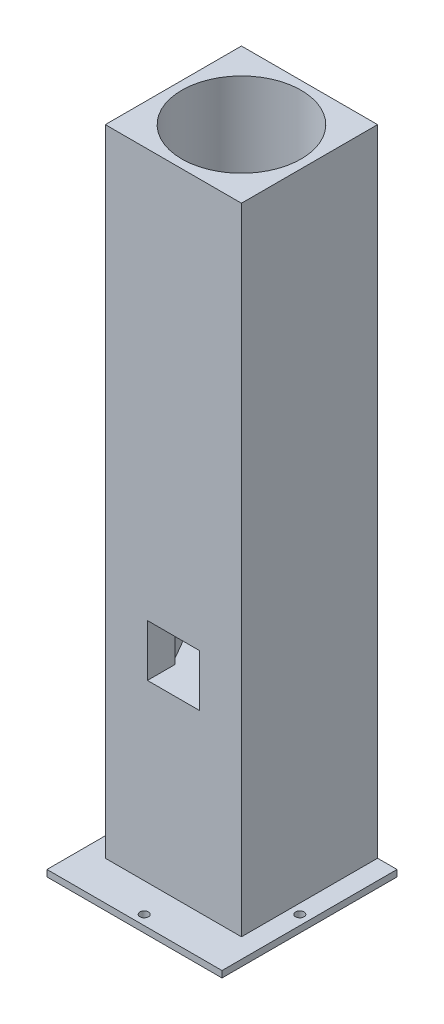
ISO-10303-21;
HEADER;
FILE_DESCRIPTION(('STEP AP214'),'2;1');
FILE_NAME('part.step','',(''),(''),'','','');
FILE_SCHEMA(('AUTOMOTIVE_DESIGN { 1 0 10303 214 1 1 1 1 }'));
ENDSEC;
DATA;
#1=APPLICATION_CONTEXT('core data for automotive mechanical design processes');
#2=APPLICATION_PROTOCOL_DEFINITION('international standard','automotive_design',2000,#1);
#3=PRODUCT_CONTEXT('',#1,'mechanical');
#4=PRODUCT('Part','Part','',(#3));
#5=PRODUCT_RELATED_PRODUCT_CATEGORY('part','',(#4));
#6=PRODUCT_DEFINITION_FORMATION('','',#4);
#7=PRODUCT_DEFINITION_CONTEXT('part definition',#1,'design');
#8=PRODUCT_DEFINITION('design','',#6,#7);
#9=PRODUCT_DEFINITION_SHAPE('','',#8);
#10=(LENGTH_UNIT() NAMED_UNIT(*) SI_UNIT(.MILLI.,.METRE.));
#11=(NAMED_UNIT(*) PLANE_ANGLE_UNIT() SI_UNIT($,.RADIAN.));
#12=(NAMED_UNIT(*) SI_UNIT($,.STERADIAN.) SOLID_ANGLE_UNIT());
#13=UNCERTAINTY_MEASURE_WITH_UNIT(LENGTH_MEASURE(1.E-05),#10,'distance_accuracy_value','');
#14=(GEOMETRIC_REPRESENTATION_CONTEXT(3) GLOBAL_UNCERTAINTY_ASSIGNED_CONTEXT((#13)) GLOBAL_UNIT_ASSIGNED_CONTEXT((#10,
#11,#12)) REPRESENTATION_CONTEXT('',''));
#15=CARTESIAN_POINT('',(0.,0.,0.));
#16=DIRECTION('',(0.,0.,1.));
#17=DIRECTION('',(1.,0.,0.));
#18=AXIS2_PLACEMENT_3D('',#15,#16,#17);
#19=CARTESIAN_POINT('',(0.,50.,26.25));
#20=DIRECTION('',(0.,0.,-1.));
#21=DIRECTION('',(-1.,0.,0.));
#22=AXIS2_PLACEMENT_3D('',#19,#20,#21);
#23=PLANE('',#22);
#24=DIRECTION('',(-1.,0.,0.));
#25=VECTOR('',#24,1.);
#26=CARTESIAN_POINT('',(10.,20.,26.25));
#27=LINE('',#26,#25);
#28=CARTESIAN_POINT('',(10.,20.,26.25));
#29=VERTEX_POINT('',#28);
#30=CARTESIAN_POINT('',(-10.,20.,26.25));
#31=VERTEX_POINT('',#30);
#32=EDGE_CURVE('E386',#29,#31,#27,.T.);
#33=ORIENTED_EDGE('',*,*,#32,.F.);
#34=DIRECTION('',(0.,1.,0.));
#35=VECTOR('',#34,1.);
#36=CARTESIAN_POINT('',(10.,20.,26.25));
#37=LINE('',#36,#35);
#38=CARTESIAN_POINT('',(10.,0.,26.25));
#39=VERTEX_POINT('',#38);
#40=EDGE_CURVE('E373',#39,#29,#37,.T.);
#41=ORIENTED_EDGE('',*,*,#40,.F.);
#42=DIRECTION('',(1.,0.,0.));
#43=VECTOR('',#42,1.);
#44=CARTESIAN_POINT('',(10.,0.,26.25));
#45=LINE('',#44,#43);
#46=CARTESIAN_POINT('',(-10.,0.,26.25));
#47=VERTEX_POINT('',#46);
#48=EDGE_CURVE('E393',#47,#39,#45,.T.);
#49=ORIENTED_EDGE('',*,*,#48,.F.);
#50=DIRECTION('',(0.,-1.,0.));
#51=VECTOR('',#50,1.);
#52=CARTESIAN_POINT('',(-10.,20.,26.25));
#53=LINE('',#52,#51);
#54=EDGE_CURVE('E389',#31,#47,#53,.T.);
#55=ORIENTED_EDGE('',*,*,#54,.F.);
#56=EDGE_LOOP('',(#33,#41,#49,#55));
#57=FACE_BOUND('',#56,.T.);
#58=DIRECTION('',(-1.,0.,0.));
#59=VECTOR('',#58,1.);
#60=CARTESIAN_POINT('',(0.,-67.5,26.25));
#61=LINE('',#60,#59);
#62=CARTESIAN_POINT('',(26.25,-67.5,26.25));
#63=VERTEX_POINT('',#62);
#64=CARTESIAN_POINT('',(-26.25,-67.5,26.25));
#65=VERTEX_POINT('',#64);
#66=EDGE_CURVE('E329',#63,#65,#61,.T.);
#67=ORIENTED_EDGE('',*,*,#66,.F.);
#68=DIRECTION('',(0.,-1.,0.));
#69=VECTOR('',#68,1.);
#70=CARTESIAN_POINT('',(26.25,198.41623264269,26.25));
#71=LINE('',#70,#69);
#72=CARTESIAN_POINT('',(26.25,177.5,26.25));
#73=VERTEX_POINT('',#72);
#74=EDGE_CURVE('E434',#73,#63,#71,.T.);
#75=ORIENTED_EDGE('',*,*,#74,.F.);
#76=DIRECTION('',(-1.,0.,0.));
#77=VECTOR('',#76,1.);
#78=CARTESIAN_POINT('',(0.,177.5,26.25));
#79=LINE('',#78,#77);
#80=CARTESIAN_POINT('',(-26.25,177.5,26.25));
#81=VERTEX_POINT('',#80);
#82=EDGE_CURVE('E448',#73,#81,#79,.T.);
#83=ORIENTED_EDGE('',*,*,#82,.T.);
#84=DIRECTION('',(0.,-1.,0.));
#85=VECTOR('',#84,1.);
#86=CARTESIAN_POINT('',(-26.25,198.41623264269,26.25));
#87=LINE('',#86,#85);
#88=EDGE_CURVE('E428',#81,#65,#87,.T.);
#89=ORIENTED_EDGE('',*,*,#88,.T.);
#90=EDGE_LOOP('',(#67,#75,#83,#89));
#91=FACE_BOUND('',#90,.T.);
#92=ADVANCED_FACE('F74',(#57,#91),#23,.F.);
#93=CARTESIAN_POINT('',(26.25,50.,0.));
#94=DIRECTION('',(-1.,0.,0.));
#95=DIRECTION('',(0.,0.,1.));
#96=AXIS2_PLACEMENT_3D('',#93,#94,#95);
#97=PLANE('',#96);
#98=DIRECTION('',(0.,0.,1.));
#99=VECTOR('',#98,1.);
#100=CARTESIAN_POINT('',(26.25,-67.5,0.));
#101=LINE('',#100,#99);
#102=CARTESIAN_POINT('',(26.25,-67.5,-26.25));
#103=VERTEX_POINT('',#102);
#104=EDGE_CURVE('E332',#103,#63,#101,.T.);
#105=ORIENTED_EDGE('',*,*,#104,.F.);
#106=DIRECTION('',(0.,-1.,0.));
#107=VECTOR('',#106,1.);
#108=CARTESIAN_POINT('',(26.25,198.41623264269,-26.25));
#109=LINE('',#108,#107);
#110=CARTESIAN_POINT('',(26.25,177.5,-26.25));
#111=VERTEX_POINT('',#110);
#112=EDGE_CURVE('E429',#111,#103,#109,.T.);
#113=ORIENTED_EDGE('',*,*,#112,.F.);
#114=DIRECTION('',(0.,0.,1.));
#115=VECTOR('',#114,1.);
#116=CARTESIAN_POINT('',(26.25,177.5,0.));
#117=LINE('',#116,#115);
#118=EDGE_CURVE('E452',#111,#73,#117,.T.);
#119=ORIENTED_EDGE('',*,*,#118,.T.);
#120=ORIENTED_EDGE('',*,*,#74,.T.);
#121=EDGE_LOOP('',(#105,#113,#119,#120));
#122=FACE_BOUND('',#121,.T.);
#123=ADVANCED_FACE('F667',(#122),#97,.F.);
#124=CARTESIAN_POINT('',(-26.25,50.,0.));
#125=DIRECTION('',(-1.,0.,0.));
#126=DIRECTION('',(0.,0.,1.));
#127=AXIS2_PLACEMENT_3D('',#124,#125,#126);
#128=PLANE('',#127);
#129=DIRECTION('',(0.,-1.,0.));
#130=VECTOR('',#129,1.);
#131=CARTESIAN_POINT('',(-26.25,198.41623264269,-26.25));
#132=LINE('',#131,#130);
#133=CARTESIAN_POINT('',(-26.25,177.5,-26.25));
#134=VERTEX_POINT('',#133);
#135=CARTESIAN_POINT('',(-26.25,-67.5,-26.25));
#136=VERTEX_POINT('',#135);
#137=EDGE_CURVE('E433',#134,#136,#132,.T.);
#138=ORIENTED_EDGE('',*,*,#137,.T.);
#139=DIRECTION('',(0.,0.,-1.));
#140=VECTOR('',#139,1.);
#141=CARTESIAN_POINT('',(-26.25,-67.5,0.));
#142=LINE('',#141,#140);
#143=EDGE_CURVE('E326',#65,#136,#142,.T.);
#144=ORIENTED_EDGE('',*,*,#143,.F.);
#145=ORIENTED_EDGE('',*,*,#88,.F.);
#146=DIRECTION('',(0.,0.,1.));
#147=VECTOR('',#146,1.);
#148=CARTESIAN_POINT('',(-26.25,177.5,0.));
#149=LINE('',#148,#147);
#150=EDGE_CURVE('E459',#134,#81,#149,.T.);
#151=ORIENTED_EDGE('',*,*,#150,.F.);
#152=EDGE_LOOP('',(#138,#144,#145,#151));
#153=FACE_BOUND('',#152,.T.);
#154=ADVANCED_FACE('F672',(#153),#128,.T.);
#155=CARTESIAN_POINT('',(0.,50.,0.));
#156=DIRECTION('',(0.,1.,0.));
#157=DIRECTION('',(0.,0.,1.));
#158=AXIS2_PLACEMENT_3D('',#155,#156,#157);
#159=PLANE('',#158);
#160=DIRECTION('',(0.,0.,1.));
#161=VECTOR('',#160,1.);
#162=CARTESIAN_POINT('',(-18.4781654946951,50.,0.));
#163=LINE('',#162,#161);
#164=CARTESIAN_POINT('',(-18.4781654946951,50.,-2.46999999999999));
#165=VERTEX_POINT('',#164);
#166=CARTESIAN_POINT('',(-18.4781654946951,50.,2.47000000000001));
#167=VERTEX_POINT('',#166);
#168=EDGE_CURVE('E463',#165,#167,#163,.T.);
#169=ORIENTED_EDGE('',*,*,#168,.F.);
#170=DIRECTION('',(0.5,0.,-0.866025403784439));
#171=VECTOR('',#170,1.);
#172=CARTESIAN_POINT('',(-14.9281654946951,50.,-8.61878036686951));
#173=LINE('',#172,#171);
#174=CARTESIAN_POINT('',(-11.3781654946951,50.,-14.767560733739));
#175=VERTEX_POINT('',#174);
#176=EDGE_CURVE('E467',#165,#175,#173,.T.);
#177=ORIENTED_EDGE('',*,*,#176,.T.);
#178=DIRECTION('',(-0.866025403784439,0.,0.5));
#179=VECTOR('',#178,1.);
#180=CARTESIAN_POINT('',(-9.23908274734755,50.,-16.002560733739));
#181=LINE('',#180,#179);
#182=CARTESIAN_POINT('',(-7.1,50.,-17.237560733739));
#183=VERTEX_POINT('',#182);
#184=EDGE_CURVE('E471',#183,#175,#181,.T.);
#185=ORIENTED_EDGE('',*,*,#184,.F.);
#186=DIRECTION('',(1.,0.,0.));
#187=VECTOR('',#186,1.);
#188=CARTESIAN_POINT('',(0.,50.,-17.237560733739));
#189=LINE('',#188,#187);
#190=CARTESIAN_POINT('',(7.1,50.,-17.237560733739));
#191=VERTEX_POINT('',#190);
#192=EDGE_CURVE('E475',#183,#191,#189,.T.);
#193=ORIENTED_EDGE('',*,*,#192,.T.);
#194=DIRECTION('',(-0.866025403784439,0.,-0.5));
#195=VECTOR('',#194,1.);
#196=CARTESIAN_POINT('',(9.23908274734756,50.,-16.002560733739));
#197=LINE('',#196,#195);
#198=CARTESIAN_POINT('',(11.3781654946951,50.,-14.767560733739));
#199=VERTEX_POINT('',#198);
#200=EDGE_CURVE('E478',#199,#191,#197,.T.);
#201=ORIENTED_EDGE('',*,*,#200,.F.);
#202=DIRECTION('',(0.5,0.,0.866025403784438));
#203=VECTOR('',#202,1.);
#204=CARTESIAN_POINT('',(14.9281654946951,50.,-8.61878036686952));
#205=LINE('',#204,#203);
#206=CARTESIAN_POINT('',(18.4781654946951,50.,-2.47));
#207=VERTEX_POINT('',#206);
#208=EDGE_CURVE('E482',#199,#207,#205,.T.);
#209=ORIENTED_EDGE('',*,*,#208,.T.);
#210=DIRECTION('',(0.,0.,-1.));
#211=VECTOR('',#210,1.);
#212=CARTESIAN_POINT('',(18.4781654946951,50.,0.));
#213=LINE('',#212,#211);
#214=CARTESIAN_POINT('',(18.4781654946951,50.,2.47));
#215=VERTEX_POINT('',#214);
#216=EDGE_CURVE('E485',#215,#207,#213,.T.);
#217=ORIENTED_EDGE('',*,*,#216,.F.);
#218=DIRECTION('',(-0.5,0.,0.866025403784439));
#219=VECTOR('',#218,1.);
#220=CARTESIAN_POINT('',(14.9281654946951,50.,8.61878036686951));
#221=LINE('',#220,#219);
#222=CARTESIAN_POINT('',(11.3781654946951,50.,14.767560733739));
#223=VERTEX_POINT('',#222);
#224=EDGE_CURVE('E489',#215,#223,#221,.T.);
#225=ORIENTED_EDGE('',*,*,#224,.T.);
#226=DIRECTION('',(0.866025403784439,0.,-0.5));
#227=VECTOR('',#226,1.);
#228=CARTESIAN_POINT('',(9.23908274734756,50.,16.002560733739));
#229=LINE('',#228,#227);
#230=CARTESIAN_POINT('',(7.1,50.,17.237560733739));
#231=VERTEX_POINT('',#230);
#232=EDGE_CURVE('E492',#231,#223,#229,.T.);
#233=ORIENTED_EDGE('',*,*,#232,.F.);
#234=DIRECTION('',(-1.,0.,0.));
#235=VECTOR('',#234,1.);
#236=CARTESIAN_POINT('',(0.,50.,17.237560733739));
#237=LINE('',#236,#235);
#238=CARTESIAN_POINT('',(-7.1,50.,17.237560733739));
#239=VERTEX_POINT('',#238);
#240=EDGE_CURVE('E496',#231,#239,#237,.T.);
#241=ORIENTED_EDGE('',*,*,#240,.T.);
#242=DIRECTION('',(0.866025403784439,0.,0.499999999999999));
#243=VECTOR('',#242,1.);
#244=CARTESIAN_POINT('',(-9.23908274734755,50.,16.002560733739));
#245=LINE('',#244,#243);
#246=CARTESIAN_POINT('',(-11.3781654946951,50.,14.767560733739));
#247=VERTEX_POINT('',#246);
#248=EDGE_CURVE('E499',#247,#239,#245,.T.);
#249=ORIENTED_EDGE('',*,*,#248,.F.);
#250=DIRECTION('',(-0.5,0.,-0.866025403784439));
#251=VECTOR('',#250,1.);
#252=CARTESIAN_POINT('',(-14.9281654946951,50.,8.61878036686952));
#253=LINE('',#252,#251);
#254=EDGE_CURVE('E503',#247,#167,#253,.T.);
#255=ORIENTED_EDGE('',*,*,#254,.T.);
#256=EDGE_LOOP('',(#169,#177,#185,#193,#201,#209,#217,#225,#233,#241,#249,#255));
#257=FACE_BOUND('',#256,.T.);
#258=CARTESIAN_POINT('',(0.,50.,0.));
#259=DIRECTION('',(0.,1.,0.));
#260=DIRECTION('',(0.,0.,1.));
#261=AXIS2_PLACEMENT_3D('',#258,#259,#260);
#262=CIRCLE('',#261,23.);
#263=CARTESIAN_POINT('',(0.,50.,23.));
#264=VERTEX_POINT('',#263);
#265=EDGE_CURVE('E12',#264,#264,#262,.F.);
#266=ORIENTED_EDGE('',*,*,#265,.F.);
#267=EDGE_LOOP('',(#266));
#268=FACE_BOUND('',#267,.T.);
#269=ADVANCED_FACE('F606',(#257,#268),#159,.T.);
#270=CARTESIAN_POINT('',(-18.4781654946951,50.,0.));
#271=DIRECTION('',(1.,0.,0.));
#272=DIRECTION('',(0.,0.,-1.));
#273=AXIS2_PLACEMENT_3D('',#270,#271,#272);
#274=PLANE('',#273);
#275=DIRECTION('',(0.,0.,1.));
#276=VECTOR('',#275,1.);
#277=CARTESIAN_POINT('',(-18.4781654946951,0.,0.));
#278=LINE('',#277,#276);
#279=CARTESIAN_POINT('',(-18.4781654946951,0.,-2.46999999999999));
#280=VERTEX_POINT('',#279);
#281=CARTESIAN_POINT('',(-18.4781654946951,0.,2.47000000000001));
#282=VERTEX_POINT('',#281);
#283=EDGE_CURVE('E462',#280,#282,#278,.T.);
#284=ORIENTED_EDGE('',*,*,#283,.F.);
#285=DIRECTION('',(0.,-1.,0.));
#286=VECTOR('',#285,1.);
#287=CARTESIAN_POINT('',(-18.4781654946951,50.,-2.46999999999999));
#288=LINE('',#287,#286);
#289=EDGE_CURVE('E82',#165,#280,#288,.T.);
#290=ORIENTED_EDGE('',*,*,#289,.F.);
#291=ORIENTED_EDGE('',*,*,#168,.T.);
#292=DIRECTION('',(0.,-1.,0.));
#293=VECTOR('',#292,1.);
#294=CARTESIAN_POINT('',(-18.4781654946951,50.,2.47000000000001));
#295=LINE('',#294,#293);
#296=EDGE_CURVE('E506',#167,#282,#295,.T.);
#297=ORIENTED_EDGE('',*,*,#296,.T.);
#298=EDGE_LOOP('',(#284,#290,#291,#297));
#299=FACE_BOUND('',#298,.T.);
#300=ADVANCED_FACE('F595',(#299),#274,.T.);
#301=CARTESIAN_POINT('',(-14.9281654946951,50.,-8.61878036686951));
#302=DIRECTION('',(-0.866025403784439,0.,-0.499999999999999));
#303=DIRECTION('',(-0.5,0.,0.866025403784439));
#304=AXIS2_PLACEMENT_3D('',#301,#302,#303);
#305=PLANE('',#304);
#306=DIRECTION('',(0.5,0.,-0.866025403784439));
#307=VECTOR('',#306,1.);
#308=CARTESIAN_POINT('',(-14.9281654946951,0.,-8.61878036686951));
#309=LINE('',#308,#307);
#310=CARTESIAN_POINT('',(-11.3781654946951,0.,-14.767560733739));
#311=VERTEX_POINT('',#310);
#312=EDGE_CURVE('E509',#280,#311,#309,.T.);
#313=ORIENTED_EDGE('',*,*,#312,.T.);
#314=DIRECTION('',(0.,-1.,0.));
#315=VECTOR('',#314,1.);
#316=CARTESIAN_POINT('',(-11.3781654946951,50.,-14.767560733739));
#317=LINE('',#316,#315);
#318=EDGE_CURVE('E583',#175,#311,#317,.T.);
#319=ORIENTED_EDGE('',*,*,#318,.F.);
#320=ORIENTED_EDGE('',*,*,#176,.F.);
#321=ORIENTED_EDGE('',*,*,#289,.T.);
#322=EDGE_LOOP('',(#313,#319,#320,#321));
#323=FACE_BOUND('',#322,.T.);
#324=ADVANCED_FACE('F591',(#323),#305,.F.);
#325=CARTESIAN_POINT('',(-9.23908274734755,50.,-16.002560733739));
#326=DIRECTION('',(0.499999999999999,0.,0.866025403784439));
#327=DIRECTION('',(0.866025403784439,0.,-0.5));
#328=AXIS2_PLACEMENT_3D('',#325,#326,#327);
#329=PLANE('',#328);
#330=DIRECTION('',(-0.866025403784439,0.,0.5));
#331=VECTOR('',#330,1.);
#332=CARTESIAN_POINT('',(-9.23908274734755,0.,-16.002560733739));
#333=LINE('',#332,#331);
#334=CARTESIAN_POINT('',(-7.1,0.,-17.237560733739));
#335=VERTEX_POINT('',#334);
#336=EDGE_CURVE('E513',#335,#311,#333,.T.);
#337=ORIENTED_EDGE('',*,*,#336,.F.);
#338=DIRECTION('',(0.,-1.,0.));
#339=VECTOR('',#338,1.);
#340=CARTESIAN_POINT('',(-7.1,50.,-17.237560733739));
#341=LINE('',#340,#339);
#342=EDGE_CURVE('E579',#183,#335,#341,.T.);
#343=ORIENTED_EDGE('',*,*,#342,.F.);
#344=ORIENTED_EDGE('',*,*,#184,.T.);
#345=ORIENTED_EDGE('',*,*,#318,.T.);
#346=EDGE_LOOP('',(#337,#343,#344,#345));
#347=FACE_BOUND('',#346,.T.);
#348=ADVANCED_FACE('F602',(#347),#329,.T.);
#349=CARTESIAN_POINT('',(0.,50.,-17.237560733739));
#350=DIRECTION('',(0.,0.,-1.));
#351=DIRECTION('',(-1.,0.,0.));
#352=AXIS2_PLACEMENT_3D('',#349,#350,#351);
#353=PLANE('',#352);
#354=DIRECTION('',(1.,0.,0.));
#355=VECTOR('',#354,1.);
#356=CARTESIAN_POINT('',(0.,0.,-17.237560733739));
#357=LINE('',#356,#355);
#358=CARTESIAN_POINT('',(7.1,0.,-17.237560733739));
#359=VERTEX_POINT('',#358);
#360=EDGE_CURVE('E516',#335,#359,#357,.T.);
#361=ORIENTED_EDGE('',*,*,#360,.T.);
#362=DIRECTION('',(0.,-1.,0.));
#363=VECTOR('',#362,1.);
#364=CARTESIAN_POINT('',(7.1,50.,-17.237560733739));
#365=LINE('',#364,#363);
#366=EDGE_CURVE('E575',#191,#359,#365,.T.);
#367=ORIENTED_EDGE('',*,*,#366,.F.);
#368=ORIENTED_EDGE('',*,*,#192,.F.);
#369=ORIENTED_EDGE('',*,*,#342,.T.);
#370=EDGE_LOOP('',(#361,#367,#368,#369));
#371=FACE_BOUND('',#370,.T.);
#372=ADVANCED_FACE('F657',(#371),#353,.F.);
#373=CARTESIAN_POINT('',(9.23908274734756,50.,-16.002560733739));
#374=DIRECTION('',(-0.5,0.,0.866025403784439));
#375=DIRECTION('',(0.866025403784439,0.,0.5));
#376=AXIS2_PLACEMENT_3D('',#373,#374,#375);
#377=PLANE('',#376);
#378=DIRECTION('',(-0.866025403784439,0.,-0.5));
#379=VECTOR('',#378,1.);
#380=CARTESIAN_POINT('',(9.23908274734756,0.,-16.002560733739));
#381=LINE('',#380,#379);
#382=CARTESIAN_POINT('',(11.3781654946951,0.,-14.767560733739));
#383=VERTEX_POINT('',#382);
#384=EDGE_CURVE('E520',#383,#359,#381,.T.);
#385=ORIENTED_EDGE('',*,*,#384,.F.);
#386=DIRECTION('',(0.,-1.,0.));
#387=VECTOR('',#386,1.);
#388=CARTESIAN_POINT('',(11.3781654946951,50.,-14.767560733739));
#389=LINE('',#388,#387);
#390=EDGE_CURVE('E571',#199,#383,#389,.T.);
#391=ORIENTED_EDGE('',*,*,#390,.F.);
#392=ORIENTED_EDGE('',*,*,#200,.T.);
#393=ORIENTED_EDGE('',*,*,#366,.T.);
#394=EDGE_LOOP('',(#385,#391,#392,#393));
#395=FACE_BOUND('',#394,.T.);
#396=ADVANCED_FACE('F655',(#395),#377,.T.);
#397=CARTESIAN_POINT('',(14.9281654946951,50.,-8.61878036686952));
#398=DIRECTION('',(0.866025403784438,0.,-0.5));
#399=DIRECTION('',(-0.5,0.,-0.866025403784438));
#400=AXIS2_PLACEMENT_3D('',#397,#398,#399);
#401=PLANE('',#400);
#402=DIRECTION('',(0.5,0.,0.866025403784438));
#403=VECTOR('',#402,1.);
#404=CARTESIAN_POINT('',(14.9281654946951,0.,-8.61878036686952));
#405=LINE('',#404,#403);
#406=CARTESIAN_POINT('',(18.4781654946951,0.,-2.47));
#407=VERTEX_POINT('',#406);
#408=EDGE_CURVE('E523',#383,#407,#405,.T.);
#409=ORIENTED_EDGE('',*,*,#408,.T.);
#410=DIRECTION('',(0.,-1.,0.));
#411=VECTOR('',#410,1.);
#412=CARTESIAN_POINT('',(18.4781654946951,50.,-2.47));
#413=LINE('',#412,#411);
#414=EDGE_CURVE('E567',#207,#407,#413,.T.);
#415=ORIENTED_EDGE('',*,*,#414,.F.);
#416=ORIENTED_EDGE('',*,*,#208,.F.);
#417=ORIENTED_EDGE('',*,*,#390,.T.);
#418=EDGE_LOOP('',(#409,#415,#416,#417));
#419=FACE_BOUND('',#418,.T.);
#420=ADVANCED_FACE('F652',(#419),#401,.F.);
#421=CARTESIAN_POINT('',(18.4781654946951,50.,0.));
#422=DIRECTION('',(-1.,0.,0.));
#423=DIRECTION('',(0.,0.,1.));
#424=AXIS2_PLACEMENT_3D('',#421,#422,#423);
#425=PLANE('',#424);
#426=DIRECTION('',(0.,0.,-1.));
#427=VECTOR('',#426,1.);
#428=CARTESIAN_POINT('',(18.4781654946951,0.,0.));
#429=LINE('',#428,#427);
#430=CARTESIAN_POINT('',(18.4781654946951,0.,2.47));
#431=VERTEX_POINT('',#430);
#432=EDGE_CURVE('E527',#431,#407,#429,.T.);
#433=ORIENTED_EDGE('',*,*,#432,.F.);
#434=DIRECTION('',(0.,-1.,0.));
#435=VECTOR('',#434,1.);
#436=CARTESIAN_POINT('',(18.4781654946951,50.,2.47));
#437=LINE('',#436,#435);
#438=EDGE_CURVE('E563',#215,#431,#437,.T.);
#439=ORIENTED_EDGE('',*,*,#438,.F.);
#440=ORIENTED_EDGE('',*,*,#216,.T.);
#441=ORIENTED_EDGE('',*,*,#414,.T.);
#442=EDGE_LOOP('',(#433,#439,#440,#441));
#443=FACE_BOUND('',#442,.T.);
#444=ADVANCED_FACE('F649',(#443),#425,.T.);
#445=CARTESIAN_POINT('',(14.9281654946951,50.,8.61878036686951));
#446=DIRECTION('',(0.866025403784439,0.,0.5));
#447=DIRECTION('',(0.5,0.,-0.866025403784439));
#448=AXIS2_PLACEMENT_3D('',#445,#446,#447);
#449=PLANE('',#448);
#450=DIRECTION('',(-0.5,0.,0.866025403784439));
#451=VECTOR('',#450,1.);
#452=CARTESIAN_POINT('',(14.9281654946951,0.,8.61878036686951));
#453=LINE('',#452,#451);
#454=CARTESIAN_POINT('',(11.3781654946951,0.,14.767560733739));
#455=VERTEX_POINT('',#454);
#456=EDGE_CURVE('E530',#431,#455,#453,.T.);
#457=ORIENTED_EDGE('',*,*,#456,.T.);
#458=DIRECTION('',(0.,-1.,0.));
#459=VECTOR('',#458,1.);
#460=CARTESIAN_POINT('',(11.3781654946951,50.,14.767560733739));
#461=LINE('',#460,#459);
#462=EDGE_CURVE('E559',#223,#455,#461,.T.);
#463=ORIENTED_EDGE('',*,*,#462,.F.);
#464=ORIENTED_EDGE('',*,*,#224,.F.);
#465=ORIENTED_EDGE('',*,*,#438,.T.);
#466=EDGE_LOOP('',(#457,#463,#464,#465));
#467=FACE_BOUND('',#466,.T.);
#468=ADVANCED_FACE('F645',(#467),#449,.F.);
#469=CARTESIAN_POINT('',(9.23908274734756,50.,16.002560733739));
#470=DIRECTION('',(-0.5,0.,-0.866025403784439));
#471=DIRECTION('',(-0.866025403784439,0.,0.5));
#472=AXIS2_PLACEMENT_3D('',#469,#470,#471);
#473=PLANE('',#472);
#474=DIRECTION('',(0.,-1.,0.));
#475=VECTOR('',#474,1.);
#476=CARTESIAN_POINT('',(10.,50.,15.5632449530891));
#477=LINE('',#476,#475);
#478=CARTESIAN_POINT('',(10.,20.,15.5632449530891));
#479=VERTEX_POINT('',#478);
#480=CARTESIAN_POINT('',(10.,0.,15.5632449530891));
#481=VERTEX_POINT('',#480);
#482=EDGE_CURVE('E412',#479,#481,#477,.T.);
#483=ORIENTED_EDGE('',*,*,#482,.F.);
#484=DIRECTION('',(0.866025403784439,0.,-0.5));
#485=VECTOR('',#484,1.);
#486=CARTESIAN_POINT('',(9.23908274734756,20.,16.002560733739));
#487=LINE('',#486,#485);
#488=CARTESIAN_POINT('',(7.1,20.,17.237560733739));
#489=VERTEX_POINT('',#488);
#490=EDGE_CURVE('E422',#489,#479,#487,.T.);
#491=ORIENTED_EDGE('',*,*,#490,.F.);
#492=DIRECTION('',(0.,-1.,0.));
#493=VECTOR('',#492,1.);
#494=CARTESIAN_POINT('',(7.1,50.,17.237560733739));
#495=LINE('',#494,#493);
#496=EDGE_CURVE('E555',#231,#489,#495,.T.);
#497=ORIENTED_EDGE('',*,*,#496,.F.);
#498=ORIENTED_EDGE('',*,*,#232,.T.);
#499=ORIENTED_EDGE('',*,*,#462,.T.);
#500=DIRECTION('',(0.866025403784439,0.,-0.5));
#501=VECTOR('',#500,1.);
#502=CARTESIAN_POINT('',(9.23908274734756,0.,16.002560733739));
#503=LINE('',#502,#501);
#504=EDGE_CURVE('E534',#481,#455,#503,.T.);
#505=ORIENTED_EDGE('',*,*,#504,.F.);
#506=EDGE_LOOP('',(#483,#491,#497,#498,#499,#505));
#507=FACE_BOUND('',#506,.T.);
#508=ADVANCED_FACE('F634',(#507),#473,.T.);
#509=CARTESIAN_POINT('',(0.,50.,17.237560733739));
#510=DIRECTION('',(0.,0.,1.));
#511=DIRECTION('',(1.,0.,0.));
#512=AXIS2_PLACEMENT_3D('',#509,#510,#511);
#513=PLANE('',#512);
#514=ORIENTED_EDGE('',*,*,#496,.T.);
#515=DIRECTION('',(-1.,0.,0.));
#516=VECTOR('',#515,1.);
#517=CARTESIAN_POINT('',(0.,20.,17.237560733739));
#518=LINE('',#517,#516);
#519=CARTESIAN_POINT('',(-7.1,20.,17.237560733739));
#520=VERTEX_POINT('',#519);
#521=EDGE_CURVE('E418',#489,#520,#518,.T.);
#522=ORIENTED_EDGE('',*,*,#521,.T.);
#523=DIRECTION('',(0.,-1.,0.));
#524=VECTOR('',#523,1.);
#525=CARTESIAN_POINT('',(-7.1,50.,17.237560733739));
#526=LINE('',#525,#524);
#527=EDGE_CURVE('E551',#239,#520,#526,.T.);
#528=ORIENTED_EDGE('',*,*,#527,.F.);
#529=ORIENTED_EDGE('',*,*,#240,.F.);
#530=EDGE_LOOP('',(#514,#522,#528,#529));
#531=FACE_BOUND('',#530,.T.);
#532=ADVANCED_FACE('F638',(#531),#513,.F.);
#533=CARTESIAN_POINT('',(-9.23908274734755,50.,16.002560733739));
#534=DIRECTION('',(0.499999999999999,0.,-0.866025403784439));
#535=DIRECTION('',(-0.866025403784439,0.,-0.499999999999999));
#536=AXIS2_PLACEMENT_3D('',#533,#534,#535);
#537=PLANE('',#536);
#538=DIRECTION('',(0.,1.,0.));
#539=VECTOR('',#538,1.);
#540=CARTESIAN_POINT('',(-9.99999999999999,50.,15.5632449530891));
#541=LINE('',#540,#539);
#542=CARTESIAN_POINT('',(-10.,0.,15.5632449530891));
#543=VERTEX_POINT('',#542);
#544=CARTESIAN_POINT('',(-10.,20.,15.5632449530891));
#545=VERTEX_POINT('',#544);
#546=EDGE_CURVE('E401',#543,#545,#541,.T.);
#547=ORIENTED_EDGE('',*,*,#546,.F.);
#548=DIRECTION('',(0.866025403784439,0.,0.499999999999999));
#549=VECTOR('',#548,1.);
#550=CARTESIAN_POINT('',(-9.23908274734755,0.,16.002560733739));
#551=LINE('',#550,#549);
#552=CARTESIAN_POINT('',(-11.3781654946951,0.,14.767560733739));
#553=VERTEX_POINT('',#552);
#554=EDGE_CURVE('E537',#553,#543,#551,.T.);
#555=ORIENTED_EDGE('',*,*,#554,.F.);
#556=DIRECTION('',(0.,-1.,0.));
#557=VECTOR('',#556,1.);
#558=CARTESIAN_POINT('',(-11.3781654946951,50.,14.767560733739));
#559=LINE('',#558,#557);
#560=EDGE_CURVE('E547',#247,#553,#559,.T.);
#561=ORIENTED_EDGE('',*,*,#560,.F.);
#562=ORIENTED_EDGE('',*,*,#248,.T.);
#563=ORIENTED_EDGE('',*,*,#527,.T.);
#564=DIRECTION('',(0.866025403784439,0.,0.499999999999999));
#565=VECTOR('',#564,1.);
#566=CARTESIAN_POINT('',(-9.23908274734755,20.,16.002560733739));
#567=LINE('',#566,#565);
#568=EDGE_CURVE('E415',#545,#520,#567,.T.);
#569=ORIENTED_EDGE('',*,*,#568,.F.);
#570=EDGE_LOOP('',(#547,#555,#561,#562,#563,#569));
#571=FACE_BOUND('',#570,.T.);
#572=ADVANCED_FACE('F617',(#571),#537,.T.);
#573=CARTESIAN_POINT('',(0.,50.,-26.25));
#574=DIRECTION('',(0.,0.,-1.));
#575=DIRECTION('',(-1.,0.,0.));
#576=AXIS2_PLACEMENT_3D('',#573,#574,#575);
#577=PLANE('',#576);
#578=ORIENTED_EDGE('',*,*,#112,.T.);
#579=DIRECTION('',(1.,0.,0.));
#580=VECTOR('',#579,1.);
#581=CARTESIAN_POINT('',(0.,-67.5,-26.25));
#582=LINE('',#581,#580);
#583=CARTESIAN_POINT('',(33.75,-67.5,-26.25));
#584=VERTEX_POINT('',#583);
#585=EDGE_CURVE('E310',#103,#584,#582,.T.);
#586=ORIENTED_EDGE('',*,*,#585,.T.);
#587=DIRECTION('',(0.,-1.,0.));
#588=VECTOR('',#587,1.);
#589=CARTESIAN_POINT('',(33.75,-67.5,-26.25));
#590=LINE('',#589,#588);
#591=CARTESIAN_POINT('',(33.75,-70.,-26.25));
#592=VERTEX_POINT('',#591);
#593=EDGE_CURVE('E347',#584,#592,#590,.T.);
#594=ORIENTED_EDGE('',*,*,#593,.T.);
#595=DIRECTION('',(1.,0.,0.));
#596=VECTOR('',#595,1.);
#597=CARTESIAN_POINT('',(-26.25,-70.,-26.25));
#598=LINE('',#597,#596);
#599=CARTESIAN_POINT('',(-33.75,-70.,-26.25));
#600=VERTEX_POINT('',#599);
#601=EDGE_CURVE('E425',#600,#592,#598,.T.);
#602=ORIENTED_EDGE('',*,*,#601,.F.);
#603=DIRECTION('',(0.,-1.,0.));
#604=VECTOR('',#603,1.);
#605=CARTESIAN_POINT('',(-33.75,-67.5,-26.25));
#606=LINE('',#605,#604);
#607=CARTESIAN_POINT('',(-33.75,-67.5,-26.25));
#608=VERTEX_POINT('',#607);
#609=EDGE_CURVE('E369',#608,#600,#606,.T.);
#610=ORIENTED_EDGE('',*,*,#609,.F.);
#611=EDGE_CURVE('E316',#608,#136,#582,.T.);
#612=ORIENTED_EDGE('',*,*,#611,.T.);
#613=ORIENTED_EDGE('',*,*,#137,.F.);
#614=DIRECTION('',(-1.,0.,0.));
#615=VECTOR('',#614,1.);
#616=CARTESIAN_POINT('',(0.,177.5,-26.25));
#617=LINE('',#616,#615);
#618=EDGE_CURVE('E456',#111,#134,#617,.T.);
#619=ORIENTED_EDGE('',*,*,#618,.F.);
#620=EDGE_LOOP('',(#578,#586,#594,#602,#610,#612,#613,#619));
#621=FACE_BOUND('',#620,.T.);
#622=ADVANCED_FACE('F681',(#621),#577,.T.);
#623=CARTESIAN_POINT('',(-14.9281654946951,50.,8.61878036686952));
#624=DIRECTION('',(-0.866025403784439,0.,0.5));
#625=DIRECTION('',(0.5,0.,0.866025403784439));
#626=AXIS2_PLACEMENT_3D('',#623,#624,#625);
#627=PLANE('',#626);
#628=DIRECTION('',(-0.5,0.,-0.866025403784439));
#629=VECTOR('',#628,1.);
#630=CARTESIAN_POINT('',(-14.9281654946951,0.,8.61878036686952));
#631=LINE('',#630,#629);
#632=EDGE_CURVE('E468',#553,#282,#631,.T.);
#633=ORIENTED_EDGE('',*,*,#632,.T.);
#634=ORIENTED_EDGE('',*,*,#296,.F.);
#635=ORIENTED_EDGE('',*,*,#254,.F.);
#636=ORIENTED_EDGE('',*,*,#560,.T.);
#637=EDGE_LOOP('',(#633,#634,#635,#636));
#638=FACE_BOUND('',#637,.T.);
#639=ADVANCED_FACE('F613',(#638),#627,.F.);
#640=CARTESIAN_POINT('',(0.,177.5,0.));
#641=DIRECTION('',(0.,1.,0.));
#642=DIRECTION('',(0.,0.,1.));
#643=AXIS2_PLACEMENT_3D('',#640,#641,#642);
#644=PLANE('',#643);
#645=ORIENTED_EDGE('',*,*,#150,.T.);
#646=ORIENTED_EDGE('',*,*,#82,.F.);
#647=ORIENTED_EDGE('',*,*,#118,.F.);
#648=ORIENTED_EDGE('',*,*,#618,.T.);
#649=EDGE_LOOP('',(#645,#646,#647,#648));
#650=FACE_BOUND('',#649,.T.);
#651=CARTESIAN_POINT('',(0.,177.5,0.));
#652=DIRECTION('',(0.,1.,0.));
#653=DIRECTION('',(0.,0.,1.));
#654=AXIS2_PLACEMENT_3D('',#651,#652,#653);
#655=CIRCLE('',#654,23.);
#656=CARTESIAN_POINT('',(0.,177.5,23.));
#657=VERTEX_POINT('',#656);
#658=EDGE_CURVE('E444',#657,#657,#655,.T.);
#659=ORIENTED_EDGE('',*,*,#658,.F.);
#660=EDGE_LOOP('',(#659));
#661=FACE_BOUND('',#660,.T.);
#662=ADVANCED_FACE('F778',(#650,#661),#644,.T.);
#663=CARTESIAN_POINT('',(0.,177.5,0.));
#664=DIRECTION('',(0.,-1.,0.));
#665=DIRECTION('',(0.,0.,-1.));
#666=AXIS2_PLACEMENT_3D('',#663,#664,#665);
#667=CYLINDRICAL_SURFACE('',#666,23.);
#668=ORIENTED_EDGE('',*,*,#658,.T.);
#669=EDGE_LOOP('',(#668));
#670=FACE_BOUND('',#669,.T.);
#671=ORIENTED_EDGE('',*,*,#265,.T.);
#672=EDGE_LOOP('',(#671));
#673=FACE_BOUND('',#672,.T.);
#674=ADVANCED_FACE('F795',(#670,#673),#667,.F.);
#675=CARTESIAN_POINT('',(0.,0.,0.));
#676=DIRECTION('',(0.,-1.,0.));
#677=DIRECTION('',(0.,0.,-1.));
#678=AXIS2_PLACEMENT_3D('',#675,#676,#677);
#679=PLANE('',#678);
#680=DIRECTION('',(0.,0.,1.));
#681=VECTOR('',#680,1.);
#682=CARTESIAN_POINT('',(10.,0.,-3.75));
#683=LINE('',#682,#681);
#684=EDGE_CURVE('E398',#481,#39,#683,.T.);
#685=ORIENTED_EDGE('',*,*,#684,.F.);
#686=ORIENTED_EDGE('',*,*,#504,.T.);
#687=ORIENTED_EDGE('',*,*,#456,.F.);
#688=ORIENTED_EDGE('',*,*,#432,.T.);
#689=ORIENTED_EDGE('',*,*,#408,.F.);
#690=ORIENTED_EDGE('',*,*,#384,.T.);
#691=ORIENTED_EDGE('',*,*,#360,.F.);
#692=ORIENTED_EDGE('',*,*,#336,.T.);
#693=ORIENTED_EDGE('',*,*,#312,.F.);
#694=ORIENTED_EDGE('',*,*,#283,.T.);
#695=ORIENTED_EDGE('',*,*,#632,.F.);
#696=ORIENTED_EDGE('',*,*,#554,.T.);
#697=DIRECTION('',(0.,0.,1.));
#698=VECTOR('',#697,1.);
#699=CARTESIAN_POINT('',(-10.,0.,-3.75));
#700=LINE('',#699,#698);
#701=EDGE_CURVE('E402',#543,#47,#700,.T.);
#702=ORIENTED_EDGE('',*,*,#701,.T.);
#703=ORIENTED_EDGE('',*,*,#48,.T.);
#704=EDGE_LOOP('',(#685,#686,#687,#688,#689,#690,#691,#692,#693,#694,#695,#696,#702,#703));
#705=FACE_BOUND('',#704,.T.);
#706=ADVANCED_FACE('F599',(#705),#679,.F.);
#707=CARTESIAN_POINT('',(0.,-70.,0.));
#708=DIRECTION('',(0.,-1.,0.));
#709=DIRECTION('',(0.,0.,-1.));
#710=AXIS2_PLACEMENT_3D('',#707,#708,#709);
#711=PLANE('',#710);
#712=DIRECTION('',(0.,0.,1.));
#713=VECTOR('',#712,1.);
#714=CARTESIAN_POINT('',(22.5,-70.,-22.5));
#715=LINE('',#714,#713);
#716=CARTESIAN_POINT('',(22.5,-70.,-22.5));
#717=VERTEX_POINT('',#716);
#718=CARTESIAN_POINT('',(22.5,-70.,22.5));
#719=VERTEX_POINT('',#718);
#720=EDGE_CURVE('E89',#717,#719,#715,.T.);
#721=ORIENTED_EDGE('',*,*,#720,.F.);
#722=DIRECTION('',(1.,0.,0.));
#723=VECTOR('',#722,1.);
#724=CARTESIAN_POINT('',(-22.5,-70.,-22.5));
#725=LINE('',#724,#723);
#726=CARTESIAN_POINT('',(-22.5,-70.,-22.5));
#727=VERTEX_POINT('',#726);
#728=EDGE_CURVE('E282',#727,#717,#725,.T.);
#729=ORIENTED_EDGE('',*,*,#728,.F.);
#730=DIRECTION('',(0.,0.,-1.));
#731=VECTOR('',#730,1.);
#732=CARTESIAN_POINT('',(-22.5,-70.,-22.5));
#733=LINE('',#732,#731);
#734=CARTESIAN_POINT('',(-22.5,-70.,22.5));
#735=VERTEX_POINT('',#734);
#736=EDGE_CURVE('E286',#735,#727,#733,.T.);
#737=ORIENTED_EDGE('',*,*,#736,.F.);
#738=DIRECTION('',(-1.,0.,0.));
#739=VECTOR('',#738,1.);
#740=CARTESIAN_POINT('',(-22.5,-70.,22.5));
#741=LINE('',#740,#739);
#742=EDGE_CURVE('E295',#719,#735,#741,.T.);
#743=ORIENTED_EDGE('',*,*,#742,.F.);
#744=EDGE_LOOP('',(#721,#729,#737,#743));
#745=FACE_BOUND('',#744,.T.);
#746=ORIENTED_EDGE('',*,*,#601,.T.);
#747=DIRECTION('',(0.,0.,1.));
#748=VECTOR('',#747,1.);
#749=CARTESIAN_POINT('',(33.75,-70.,0.));
#750=LINE('',#749,#748);
#751=CARTESIAN_POINT('',(33.75,-70.,41.25));
#752=VERTEX_POINT('',#751);
#753=EDGE_CURVE('E304',#592,#752,#750,.T.);
#754=ORIENTED_EDGE('',*,*,#753,.T.);
#755=DIRECTION('',(1.,0.,0.));
#756=VECTOR('',#755,1.);
#757=CARTESIAN_POINT('',(0.,-70.,41.25));
#758=LINE('',#757,#756);
#759=CARTESIAN_POINT('',(-33.75,-70.,41.25));
#760=VERTEX_POINT('',#759);
#761=EDGE_CURVE('E351',#760,#752,#758,.T.);
#762=ORIENTED_EDGE('',*,*,#761,.F.);
#763=DIRECTION('',(0.,0.,1.));
#764=VECTOR('',#763,1.);
#765=CARTESIAN_POINT('',(-33.75,-70.,0.));
#766=LINE('',#765,#764);
#767=EDGE_CURVE('E355',#600,#760,#766,.T.);
#768=ORIENTED_EDGE('',*,*,#767,.F.);
#769=EDGE_LOOP('',(#746,#754,#762,#768));
#770=FACE_BOUND('',#769,.T.);
#771=CARTESIAN_POINT('',(0.,-70.,37.5));
#772=DIRECTION('',(0.,-1.,0.));
#773=DIRECTION('',(0.,0.,-1.));
#774=AXIS2_PLACEMENT_3D('',#771,#772,#773);
#775=CIRCLE('',#774,1.65);
#776=CARTESIAN_POINT('',(0.,-70.,35.85));
#777=VERTEX_POINT('',#776);
#778=EDGE_CURVE('E358',#777,#777,#775,.T.);
#779=ORIENTED_EDGE('',*,*,#778,.F.);
#780=EDGE_LOOP('',(#779));
#781=FACE_BOUND('',#780,.T.);
#782=CARTESIAN_POINT('',(-30.,-70.,7.5));
#783=DIRECTION('',(0.,-1.,0.));
#784=DIRECTION('',(0.,0.,-1.));
#785=AXIS2_PLACEMENT_3D('',#782,#783,#784);
#786=CIRCLE('',#785,1.65);
#787=CARTESIAN_POINT('',(-30.,-70.,5.85));
#788=VERTEX_POINT('',#787);
#789=EDGE_CURVE('E362',#788,#788,#786,.T.);
#790=ORIENTED_EDGE('',*,*,#789,.F.);
#791=EDGE_LOOP('',(#790));
#792=FACE_BOUND('',#791,.T.);
#793=CARTESIAN_POINT('',(30.,-70.,7.5));
#794=DIRECTION('',(0.,-1.,0.));
#795=DIRECTION('',(0.,0.,-1.));
#796=AXIS2_PLACEMENT_3D('',#793,#794,#795);
#797=CIRCLE('',#796,1.65);
#798=CARTESIAN_POINT('',(30.,-70.,5.85));
#799=VERTEX_POINT('',#798);
#800=EDGE_CURVE('E315',#799,#799,#797,.F.);
#801=ORIENTED_EDGE('',*,*,#800,.T.);
#802=EDGE_LOOP('',(#801));
#803=FACE_BOUND('',#802,.T.);
#804=ADVANCED_FACE('F811',(#745,#770,#781,#792,#803),#711,.T.);
#805=CARTESIAN_POINT('',(10.,20.,-3.75));
#806=DIRECTION('',(1.,0.,0.));
#807=DIRECTION('',(0.,1.,0.));
#808=AXIS2_PLACEMENT_3D('',#805,#806,#807);
#809=PLANE('',#808);
#810=ORIENTED_EDGE('',*,*,#482,.T.);
#811=ORIENTED_EDGE('',*,*,#684,.T.);
#812=ORIENTED_EDGE('',*,*,#40,.T.);
#813=DIRECTION('',(0.,0.,1.));
#814=VECTOR('',#813,1.);
#815=CARTESIAN_POINT('',(10.,20.,-3.75));
#816=LINE('',#815,#814);
#817=EDGE_CURVE('E397',#479,#29,#816,.T.);
#818=ORIENTED_EDGE('',*,*,#817,.F.);
#819=EDGE_LOOP('',(#810,#811,#812,#818));
#820=FACE_BOUND('',#819,.T.);
#821=ADVANCED_FACE('F629',(#820),#809,.F.);
#822=CARTESIAN_POINT('',(-10.,20.,-3.75));
#823=DIRECTION('',(-1.,0.,0.));
#824=DIRECTION('',(0.,-1.,0.));
#825=AXIS2_PLACEMENT_3D('',#822,#823,#824);
#826=PLANE('',#825);
#827=ORIENTED_EDGE('',*,*,#546,.T.);
#828=DIRECTION('',(0.,0.,1.));
#829=VECTOR('',#828,1.);
#830=CARTESIAN_POINT('',(-10.,20.,-3.75));
#831=LINE('',#830,#829);
#832=EDGE_CURVE('E97',#545,#31,#831,.T.);
#833=ORIENTED_EDGE('',*,*,#832,.T.);
#834=ORIENTED_EDGE('',*,*,#54,.T.);
#835=ORIENTED_EDGE('',*,*,#701,.F.);
#836=EDGE_LOOP('',(#827,#833,#834,#835));
#837=FACE_BOUND('',#836,.T.);
#838=ADVANCED_FACE('F623',(#837),#826,.F.);
#839=CARTESIAN_POINT('',(10.,20.,-3.75));
#840=DIRECTION('',(0.,1.,0.));
#841=DIRECTION('',(-1.,0.,0.));
#842=AXIS2_PLACEMENT_3D('',#839,#840,#841);
#843=PLANE('',#842);
#844=ORIENTED_EDGE('',*,*,#490,.T.);
#845=ORIENTED_EDGE('',*,*,#817,.T.);
#846=ORIENTED_EDGE('',*,*,#32,.T.);
#847=ORIENTED_EDGE('',*,*,#832,.F.);
#848=ORIENTED_EDGE('',*,*,#568,.T.);
#849=ORIENTED_EDGE('',*,*,#521,.F.);
#850=EDGE_LOOP('',(#844,#845,#846,#847,#848,#849));
#851=FACE_BOUND('',#850,.T.);
#852=ADVANCED_FACE('F631',(#851),#843,.F.);
#853=CARTESIAN_POINT('',(-33.75,-67.5,0.));
#854=DIRECTION('',(1.,0.,0.));
#855=DIRECTION('',(0.,0.,-1.));
#856=AXIS2_PLACEMENT_3D('',#853,#854,#855);
#857=PLANE('',#856);
#858=ORIENTED_EDGE('',*,*,#767,.T.);
#859=DIRECTION('',(0.,-1.,0.));
#860=VECTOR('',#859,1.);
#861=CARTESIAN_POINT('',(-33.75,-67.5,41.25));
#862=LINE('',#861,#860);
#863=CARTESIAN_POINT('',(-33.75,-67.5,41.25));
#864=VERTEX_POINT('',#863);
#865=EDGE_CURVE('E374',#864,#760,#862,.T.);
#866=ORIENTED_EDGE('',*,*,#865,.F.);
#867=DIRECTION('',(0.,0.,1.));
#868=VECTOR('',#867,1.);
#869=CARTESIAN_POINT('',(-33.75,-67.5,0.));
#870=LINE('',#869,#868);
#871=EDGE_CURVE('E323',#608,#864,#870,.T.);
#872=ORIENTED_EDGE('',*,*,#871,.F.);
#873=ORIENTED_EDGE('',*,*,#609,.T.);
#874=EDGE_LOOP('',(#858,#866,#872,#873));
#875=FACE_BOUND('',#874,.T.);
#876=ADVANCED_FACE('F843',(#875),#857,.F.);
#877=CARTESIAN_POINT('',(0.,-67.5,41.25));
#878=DIRECTION('',(0.,0.,-1.));
#879=DIRECTION('',(-1.,0.,0.));
#880=AXIS2_PLACEMENT_3D('',#877,#878,#879);
#881=PLANE('',#880);
#882=ORIENTED_EDGE('',*,*,#761,.T.);
#883=DIRECTION('',(0.,-1.,0.));
#884=VECTOR('',#883,1.);
#885=CARTESIAN_POINT('',(33.75,-67.5,41.25));
#886=LINE('',#885,#884);
#887=CARTESIAN_POINT('',(33.75,-67.5,41.25));
#888=VERTEX_POINT('',#887);
#889=EDGE_CURVE('E378',#888,#752,#886,.T.);
#890=ORIENTED_EDGE('',*,*,#889,.F.);
#891=DIRECTION('',(1.,0.,0.));
#892=VECTOR('',#891,1.);
#893=CARTESIAN_POINT('',(0.,-67.5,41.25));
#894=LINE('',#893,#892);
#895=EDGE_CURVE('E320',#864,#888,#894,.T.);
#896=ORIENTED_EDGE('',*,*,#895,.F.);
#897=ORIENTED_EDGE('',*,*,#865,.T.);
#898=EDGE_LOOP('',(#882,#890,#896,#897));
#899=FACE_BOUND('',#898,.T.);
#900=ADVANCED_FACE('F872',(#899),#881,.F.);
#901=CARTESIAN_POINT('',(-30.,-67.5,7.5));
#902=DIRECTION('',(0.,-1.,0.));
#903=DIRECTION('',(0.,0.,-1.));
#904=AXIS2_PLACEMENT_3D('',#901,#902,#903);
#905=CYLINDRICAL_SURFACE('',#904,1.65);
#906=CARTESIAN_POINT('',(-30.,-67.5,7.5));
#907=DIRECTION('',(0.,-1.,0.));
#908=DIRECTION('',(0.,0.,-1.));
#909=AXIS2_PLACEMENT_3D('',#906,#907,#908);
#910=CIRCLE('',#909,1.65);
#911=CARTESIAN_POINT('',(-30.,-67.5,5.85));
#912=VERTEX_POINT('',#911);
#913=EDGE_CURVE('E339',#912,#912,#910,.T.);
#914=ORIENTED_EDGE('',*,*,#913,.F.);
#915=EDGE_LOOP('',(#914));
#916=FACE_BOUND('',#915,.T.);
#917=ORIENTED_EDGE('',*,*,#789,.T.);
#918=EDGE_LOOP('',(#917));
#919=FACE_BOUND('',#918,.T.);
#920=ADVANCED_FACE('F881',(#916,#919),#905,.F.);
#921=CARTESIAN_POINT('',(0.,-67.5,37.5));
#922=DIRECTION('',(0.,-1.,0.));
#923=DIRECTION('',(0.,0.,-1.));
#924=AXIS2_PLACEMENT_3D('',#921,#922,#923);
#925=CYLINDRICAL_SURFACE('',#924,1.65);
#926=CARTESIAN_POINT('',(0.,-67.5,37.5));
#927=DIRECTION('',(0.,-1.,0.));
#928=DIRECTION('',(0.,0.,-1.));
#929=AXIS2_PLACEMENT_3D('',#926,#927,#928);
#930=CIRCLE('',#929,1.65);
#931=CARTESIAN_POINT('',(0.,-67.5,35.85));
#932=VERTEX_POINT('',#931);
#933=EDGE_CURVE('E335',#932,#932,#930,.T.);
#934=ORIENTED_EDGE('',*,*,#933,.F.);
#935=EDGE_LOOP('',(#934));
#936=FACE_BOUND('',#935,.T.);
#937=ORIENTED_EDGE('',*,*,#778,.T.);
#938=EDGE_LOOP('',(#937));
#939=FACE_BOUND('',#938,.T.);
#940=ADVANCED_FACE('F890',(#936,#939),#925,.F.);
#941=CARTESIAN_POINT('',(33.75,-67.5,0.));
#942=DIRECTION('',(1.,0.,0.));
#943=DIRECTION('',(0.,0.,-1.));
#944=AXIS2_PLACEMENT_3D('',#941,#942,#943);
#945=PLANE('',#944);
#946=ORIENTED_EDGE('',*,*,#753,.F.);
#947=ORIENTED_EDGE('',*,*,#593,.F.);
#948=DIRECTION('',(0.,0.,1.));
#949=VECTOR('',#948,1.);
#950=CARTESIAN_POINT('',(33.75,-67.5,0.));
#951=LINE('',#950,#949);
#952=EDGE_CURVE('E314',#584,#888,#951,.T.);
#953=ORIENTED_EDGE('',*,*,#952,.T.);
#954=ORIENTED_EDGE('',*,*,#889,.T.);
#955=EDGE_LOOP('',(#946,#947,#953,#954));
#956=FACE_BOUND('',#955,.T.);
#957=ADVANCED_FACE('F899',(#956),#945,.T.);
#958=CARTESIAN_POINT('',(30.,-67.5,7.5));
#959=DIRECTION('',(0.,-1.,0.));
#960=DIRECTION('',(0.,0.,-1.));
#961=AXIS2_PLACEMENT_3D('',#958,#959,#960);
#962=CYLINDRICAL_SURFACE('',#961,1.65);
#963=CARTESIAN_POINT('',(30.,-67.5,7.5));
#964=DIRECTION('',(0.,-1.,0.));
#965=DIRECTION('',(0.,0.,-1.));
#966=AXIS2_PLACEMENT_3D('',#963,#964,#965);
#967=CIRCLE('',#966,1.65);
#968=CARTESIAN_POINT('',(30.,-67.5,5.85));
#969=VERTEX_POINT('',#968);
#970=EDGE_CURVE('E343',#969,#969,#967,.F.);
#971=ORIENTED_EDGE('',*,*,#970,.T.);
#972=EDGE_LOOP('',(#971));
#973=FACE_BOUND('',#972,.T.);
#974=ORIENTED_EDGE('',*,*,#800,.F.);
#975=EDGE_LOOP('',(#974));
#976=FACE_BOUND('',#975,.T.);
#977=ADVANCED_FACE('F908',(#973,#976),#962,.F.);
#978=CARTESIAN_POINT('',(0.,-67.5,0.));
#979=DIRECTION('',(0.,-1.,0.));
#980=DIRECTION('',(0.,0.,-1.));
#981=AXIS2_PLACEMENT_3D('',#978,#979,#980);
#982=PLANE('',#981);
#983=ORIENTED_EDGE('',*,*,#585,.F.);
#984=ORIENTED_EDGE('',*,*,#104,.T.);
#985=ORIENTED_EDGE('',*,*,#66,.T.);
#986=ORIENTED_EDGE('',*,*,#143,.T.);
#987=ORIENTED_EDGE('',*,*,#611,.F.);
#988=ORIENTED_EDGE('',*,*,#871,.T.);
#989=ORIENTED_EDGE('',*,*,#895,.T.);
#990=ORIENTED_EDGE('',*,*,#952,.F.);
#991=EDGE_LOOP('',(#983,#984,#985,#986,#987,#988,#989,#990));
#992=FACE_BOUND('',#991,.T.);
#993=ORIENTED_EDGE('',*,*,#933,.T.);
#994=EDGE_LOOP('',(#993));
#995=FACE_BOUND('',#994,.T.);
#996=ORIENTED_EDGE('',*,*,#913,.T.);
#997=EDGE_LOOP('',(#996));
#998=FACE_BOUND('',#997,.T.);
#999=ORIENTED_EDGE('',*,*,#970,.F.);
#1000=EDGE_LOOP('',(#999));
#1001=FACE_BOUND('',#1000,.T.);
#1002=ADVANCED_FACE('F917',(#992,#995,#998,#1001),#982,.F.);
#1003=CARTESIAN_POINT('',(22.5,-10.,-22.5));
#1004=DIRECTION('',(1.,0.,0.));
#1005=DIRECTION('',(0.,0.,-1.));
#1006=AXIS2_PLACEMENT_3D('',#1003,#1004,#1005);
#1007=PLANE('',#1006);
#1008=ORIENTED_EDGE('',*,*,#720,.T.);
#1009=DIRECTION('',(0.,-1.,0.));
#1010=VECTOR('',#1009,1.);
#1011=CARTESIAN_POINT('',(22.5,-10.,22.5));
#1012=LINE('',#1011,#1010);
#1013=CARTESIAN_POINT('',(22.5,-10.,22.5));
#1014=VERTEX_POINT('',#1013);
#1015=EDGE_CURVE('E257',#1014,#719,#1012,.T.);
#1016=ORIENTED_EDGE('',*,*,#1015,.F.);
#1017=DIRECTION('',(0.,0.,1.));
#1018=VECTOR('',#1017,1.);
#1019=CARTESIAN_POINT('',(22.5,-10.,-22.5));
#1020=LINE('',#1019,#1018);
#1021=CARTESIAN_POINT('',(22.5,-10.,-22.5));
#1022=VERTEX_POINT('',#1021);
#1023=EDGE_CURVE('E261',#1022,#1014,#1020,.T.);
#1024=ORIENTED_EDGE('',*,*,#1023,.F.);
#1025=DIRECTION('',(0.,-1.,0.));
#1026=VECTOR('',#1025,1.);
#1027=CARTESIAN_POINT('',(22.5,-10.,-22.5));
#1028=LINE('',#1027,#1026);
#1029=EDGE_CURVE('E301',#1022,#717,#1028,.T.);
#1030=ORIENTED_EDGE('',*,*,#1029,.T.);
#1031=EDGE_LOOP('',(#1008,#1016,#1024,#1030));
#1032=FACE_BOUND('',#1031,.T.);
#1033=ADVANCED_FACE('F259',(#1032),#1007,.F.);
#1034=CARTESIAN_POINT('',(-22.5,-10.,-22.5));
#1035=DIRECTION('',(0.,0.,-1.));
#1036=DIRECTION('',(-1.,0.,0.));
#1037=AXIS2_PLACEMENT_3D('',#1034,#1035,#1036);
#1038=PLANE('',#1037);
#1039=ORIENTED_EDGE('',*,*,#728,.T.);
#1040=ORIENTED_EDGE('',*,*,#1029,.F.);
#1041=DIRECTION('',(1.,0.,0.));
#1042=VECTOR('',#1041,1.);
#1043=CARTESIAN_POINT('',(-22.5,-10.,-22.5));
#1044=LINE('',#1043,#1042);
#1045=CARTESIAN_POINT('',(-22.5,-10.,-22.5));
#1046=VERTEX_POINT('',#1045);
#1047=EDGE_CURVE('E268',#1046,#1022,#1044,.T.);
#1048=ORIENTED_EDGE('',*,*,#1047,.F.);
#1049=DIRECTION('',(0.,-1.,0.));
#1050=VECTOR('',#1049,1.);
#1051=CARTESIAN_POINT('',(-22.5,-10.,-22.5));
#1052=LINE('',#1051,#1050);
#1053=EDGE_CURVE('E305',#1046,#727,#1052,.T.);
#1054=ORIENTED_EDGE('',*,*,#1053,.T.);
#1055=EDGE_LOOP('',(#1039,#1040,#1048,#1054));
#1056=FACE_BOUND('',#1055,.T.);
#1057=ADVANCED_FACE('F934',(#1056),#1038,.F.);
#1058=CARTESIAN_POINT('',(-22.5,-10.,-22.5));
#1059=DIRECTION('',(-1.,0.,0.));
#1060=DIRECTION('',(0.,0.,1.));
#1061=AXIS2_PLACEMENT_3D('',#1058,#1059,#1060);
#1062=PLANE('',#1061);
#1063=ORIENTED_EDGE('',*,*,#736,.T.);
#1064=ORIENTED_EDGE('',*,*,#1053,.F.);
#1065=DIRECTION('',(0.,0.,-1.));
#1066=VECTOR('',#1065,1.);
#1067=CARTESIAN_POINT('',(-22.5,-10.,-22.5));
#1068=LINE('',#1067,#1066);
#1069=CARTESIAN_POINT('',(-22.5,-10.,22.5));
#1070=VERTEX_POINT('',#1069);
#1071=EDGE_CURVE('E277',#1070,#1046,#1068,.T.);
#1072=ORIENTED_EDGE('',*,*,#1071,.F.);
#1073=DIRECTION('',(0.,-1.,0.));
#1074=VECTOR('',#1073,1.);
#1075=CARTESIAN_POINT('',(-22.5,-10.,22.5));
#1076=LINE('',#1075,#1074);
#1077=EDGE_CURVE('E267',#1070,#735,#1076,.T.);
#1078=ORIENTED_EDGE('',*,*,#1077,.T.);
#1079=EDGE_LOOP('',(#1063,#1064,#1072,#1078));
#1080=FACE_BOUND('',#1079,.T.);
#1081=ADVANCED_FACE('F942',(#1080),#1062,.F.);
#1082=CARTESIAN_POINT('',(-22.5,-10.,22.5));
#1083=DIRECTION('',(0.,0.,1.));
#1084=DIRECTION('',(1.,0.,0.));
#1085=AXIS2_PLACEMENT_3D('',#1082,#1083,#1084);
#1086=PLANE('',#1085);
#1087=ORIENTED_EDGE('',*,*,#742,.T.);
#1088=ORIENTED_EDGE('',*,*,#1077,.F.);
#1089=DIRECTION('',(-1.,0.,0.));
#1090=VECTOR('',#1089,1.);
#1091=CARTESIAN_POINT('',(-22.5,-10.,22.5));
#1092=LINE('',#1091,#1090);
#1093=EDGE_CURVE('E271',#1014,#1070,#1092,.T.);
#1094=ORIENTED_EDGE('',*,*,#1093,.F.);
#1095=ORIENTED_EDGE('',*,*,#1015,.T.);
#1096=EDGE_LOOP('',(#1087,#1088,#1094,#1095));
#1097=FACE_BOUND('',#1096,.T.);
#1098=ADVANCED_FACE('F272',(#1097),#1086,.F.);
#1099=CARTESIAN_POINT('',(0.,-10.,0.));
#1100=DIRECTION('',(0.,1.,0.));
#1101=DIRECTION('',(0.,0.,1.));
#1102=AXIS2_PLACEMENT_3D('',#1099,#1100,#1101);
#1103=PLANE('',#1102);
#1104=ORIENTED_EDGE('',*,*,#1023,.T.);
#1105=ORIENTED_EDGE('',*,*,#1093,.T.);
#1106=ORIENTED_EDGE('',*,*,#1071,.T.);
#1107=ORIENTED_EDGE('',*,*,#1047,.T.);
#1108=EDGE_LOOP('',(#1104,#1105,#1106,#1107));
#1109=FACE_BOUND('',#1108,.T.);
#1110=ADVANCED_FACE('F279',(#1109),#1103,.F.);
#1111=CLOSED_SHELL('',(#92,#123,#154,#269,#300,#324,#348,#372,#396,#420,#444,#468,#508,#532,
#572,#622,#639,#662,#674,#706,#804,#821,#838,#852,#876,#900,#920,#940,#957,#977,#1002,#1033,
#1057,#1081,#1098,#1110));
#1112=MANIFOLD_SOLID_BREP('B2',#1111);
#1113=ADVANCED_BREP_SHAPE_REPRESENTATION('',(#18,#1112),#14);
#1114=SHAPE_DEFINITION_REPRESENTATION(#9,#1113);
ENDSEC;
END-ISO-10303-21;
